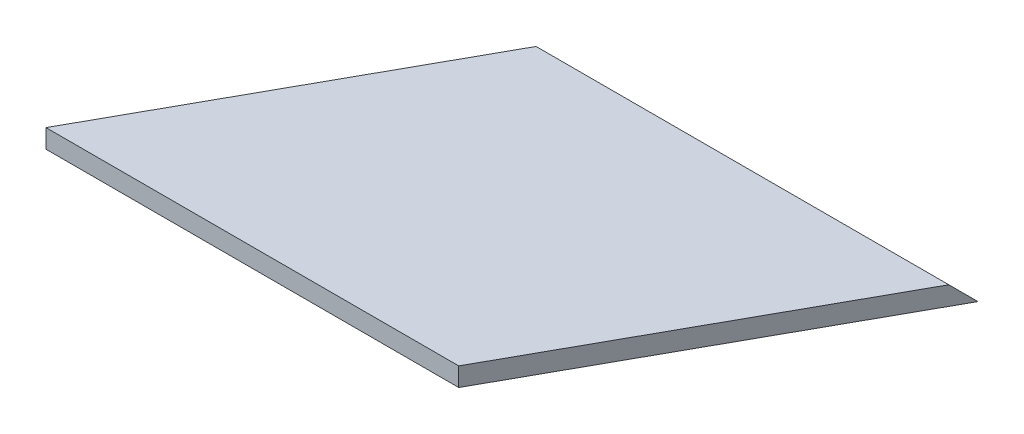
ISO-10303-21;
HEADER;
FILE_DESCRIPTION(('STEP AP214'),'2;1');
FILE_NAME('part.step','',(''),(''),'','','');
FILE_SCHEMA(('AUTOMOTIVE_DESIGN { 1 0 10303 214 1 1 1 1 }'));
ENDSEC;
DATA;
#1=APPLICATION_CONTEXT('core data for automotive mechanical design processes');
#2=APPLICATION_PROTOCOL_DEFINITION('international standard','automotive_design',2000,#1);
#3=PRODUCT_CONTEXT('',#1,'mechanical');
#4=PRODUCT('Part','Part','',(#3));
#5=PRODUCT_RELATED_PRODUCT_CATEGORY('part','',(#4));
#6=PRODUCT_DEFINITION_FORMATION('','',#4);
#7=PRODUCT_DEFINITION_CONTEXT('part definition',#1,'design');
#8=PRODUCT_DEFINITION('design','',#6,#7);
#9=PRODUCT_DEFINITION_SHAPE('','',#8);
#10=(LENGTH_UNIT() NAMED_UNIT(*) SI_UNIT(.MILLI.,.METRE.));
#11=(NAMED_UNIT(*) PLANE_ANGLE_UNIT() SI_UNIT($,.RADIAN.));
#12=(NAMED_UNIT(*) SI_UNIT($,.STERADIAN.) SOLID_ANGLE_UNIT());
#13=UNCERTAINTY_MEASURE_WITH_UNIT(LENGTH_MEASURE(1.E-05),#10,'distance_accuracy_value','');
#14=(GEOMETRIC_REPRESENTATION_CONTEXT(3) GLOBAL_UNCERTAINTY_ASSIGNED_CONTEXT((#13)) GLOBAL_UNIT_ASSIGNED_CONTEXT((#10,
#11,#12)) REPRESENTATION_CONTEXT('',''));
#15=CARTESIAN_POINT('',(0.,0.,0.));
#16=DIRECTION('',(0.,0.,1.));
#17=DIRECTION('',(1.,0.,0.));
#18=AXIS2_PLACEMENT_3D('',#15,#16,#17);
#19=CARTESIAN_POINT('',(-78.0951656166969,0.5,29.7866320004089));
#20=DIRECTION('',(0.874619707139394,0.,0.484809620246341));
#21=DIRECTION('',(0.484809620246341,0.,-0.874619707139394));
#22=AXIS2_PLACEMENT_3D('',#19,#20,#21);
#23=PLANE('',#22);
#24=DIRECTION('',(-0.484809620246341,0.,0.874619707139394));
#25=VECTOR('',#24,1.);
#26=CARTESIAN_POINT('',(-78.0951656166969,0.5,29.7866320004089));
#27=LINE('',#26,#25);
#28=CARTESIAN_POINT('',(-78.3723201424233,0.5,30.2866320004089));
#29=VERTEX_POINT('',#28);
#30=CARTESIAN_POINT('',(-83.0305275508046,0.5,38.690260619088));
#31=VERTEX_POINT('',#30);
#32=EDGE_CURVE('E72',#29,#31,#27,.T.);
#33=ORIENTED_EDGE('',*,*,#32,.F.);
#34=DIRECTION('',(0.364925188258724,-0.658342466720147,-0.658342466720146));
#35=VECTOR('',#34,1.);
#36=CARTESIAN_POINT('',(-67.9354474667235,-18.3286167226497,11.4580152777593));
#37=LINE('',#36,#35);
#38=CARTESIAN_POINT('',(-78.0951656166969,0.,29.7866320004089));
#39=VERTEX_POINT('',#38);
#40=EDGE_CURVE('E41',#29,#39,#37,.T.);
#41=ORIENTED_EDGE('',*,*,#40,.T.);
#42=DIRECTION('',(-0.484809620246341,0.,0.874619707139394));
#43=VECTOR('',#42,1.);
#44=CARTESIAN_POINT('',(-78.0951656166969,0.,29.7866320004089));
#45=LINE('',#44,#43);
#46=CARTESIAN_POINT('',(-83.0305275508046,0.,38.690260619088));
#47=VERTEX_POINT('',#46);
#48=EDGE_CURVE('E85',#39,#47,#45,.T.);
#49=ORIENTED_EDGE('',*,*,#48,.T.);
#50=DIRECTION('',(0.,-1.,0.));
#51=VECTOR('',#50,1.);
#52=CARTESIAN_POINT('',(-83.0305275508046,0.5,38.690260619088));
#53=LINE('',#52,#51);
#54=EDGE_CURVE('E83',#31,#47,#53,.T.);
#55=ORIENTED_EDGE('',*,*,#54,.F.);
#56=EDGE_LOOP('',(#33,#41,#49,#55));
#57=FACE_BOUND('',#56,.T.);
#58=ADVANCED_FACE('F33',(#57),#23,.F.);
#59=CARTESIAN_POINT('',(-83.0305275508046,0.5,38.690260619088));
#60=DIRECTION('',(0.,0.,-1.));
#61=DIRECTION('',(-1.,0.,0.));
#62=AXIS2_PLACEMENT_3D('',#59,#60,#61);
#63=PLANE('',#62);
#64=DIRECTION('',(1.,0.,0.));
#65=VECTOR('',#64,1.);
#66=CARTESIAN_POINT('',(-83.0305275508046,0.,38.690260619088));
#67=LINE('',#66,#65);
#68=CARTESIAN_POINT('',(-72.0305275508046,0.,38.690260619088));
#69=VERTEX_POINT('',#68);
#70=EDGE_CURVE('E99',#47,#69,#67,.T.);
#71=ORIENTED_EDGE('',*,*,#70,.T.);
#72=DIRECTION('',(0.,-1.,0.));
#73=VECTOR('',#72,1.);
#74=CARTESIAN_POINT('',(-72.0305275508046,0.5,38.690260619088));
#75=LINE('',#74,#73);
#76=CARTESIAN_POINT('',(-72.0305275508046,0.5,38.690260619088));
#77=VERTEX_POINT('',#76);
#78=EDGE_CURVE('E88',#77,#69,#75,.T.);
#79=ORIENTED_EDGE('',*,*,#78,.F.);
#80=DIRECTION('',(1.,0.,0.));
#81=VECTOR('',#80,1.);
#82=CARTESIAN_POINT('',(-83.0305275508046,0.5,38.690260619088));
#83=LINE('',#82,#81);
#84=EDGE_CURVE('E76',#31,#77,#83,.T.);
#85=ORIENTED_EDGE('',*,*,#84,.F.);
#86=ORIENTED_EDGE('',*,*,#54,.T.);
#87=EDGE_LOOP('',(#71,#79,#85,#86));
#88=FACE_BOUND('',#87,.T.);
#89=ADVANCED_FACE('F90',(#88),#63,.F.);
#90=CARTESIAN_POINT('',(-72.0305275508046,0.5,38.690260619088));
#91=DIRECTION('',(-0.874619707139393,0.,-0.484809620246341));
#92=DIRECTION('',(-0.484809620246341,0.,0.874619707139393));
#93=AXIS2_PLACEMENT_3D('',#90,#91,#92);
#94=PLANE('',#93);
#95=DIRECTION('',(0.484809620246342,0.,-0.874619707139393));
#96=VECTOR('',#95,1.);
#97=CARTESIAN_POINT('',(-72.0305275508046,0.,38.690260619088));
#98=LINE('',#97,#96);
#99=CARTESIAN_POINT('',(-67.0951656166969,0.,29.7866320004089));
#100=VERTEX_POINT('',#99);
#101=EDGE_CURVE('E80',#69,#100,#98,.T.);
#102=ORIENTED_EDGE('',*,*,#101,.T.);
#103=DIRECTION('',(-0.364925188258725,0.658342466720147,0.658342466720146));
#104=VECTOR('',#103,1.);
#105=CARTESIAN_POINT('',(-58.4003217900058,-15.6859134879775,14.1007185124314));
#106=LINE('',#105,#104);
#107=CARTESIAN_POINT('',(-67.3723201424232,0.5,30.2866320004089));
#108=VERTEX_POINT('',#107);
#109=EDGE_CURVE('E11',#100,#108,#106,.T.);
#110=ORIENTED_EDGE('',*,*,#109,.T.);
#111=DIRECTION('',(0.484809620246342,0.,-0.874619707139393));
#112=VECTOR('',#111,1.);
#113=CARTESIAN_POINT('',(-72.0305275508046,0.5,38.690260619088));
#114=LINE('',#113,#112);
#115=EDGE_CURVE('E92',#77,#108,#114,.T.);
#116=ORIENTED_EDGE('',*,*,#115,.F.);
#117=ORIENTED_EDGE('',*,*,#78,.T.);
#118=EDGE_LOOP('',(#102,#110,#116,#117));
#119=FACE_BOUND('',#118,.T.);
#120=ADVANCED_FACE('F116',(#119),#94,.F.);
#121=CARTESIAN_POINT('',(0.,0.5,0.));
#122=DIRECTION('',(0.,1.,0.));
#123=DIRECTION('',(0.,0.,1.));
#124=AXIS2_PLACEMENT_3D('',#121,#122,#123);
#125=PLANE('',#124);
#126=ORIENTED_EDGE('',*,*,#115,.T.);
#127=DIRECTION('',(-1.,0.,0.));
#128=VECTOR('',#127,1.);
#129=CARTESIAN_POINT('',(-78.0951656166969,0.5,30.2866320004089));
#130=LINE('',#129,#128);
#131=EDGE_CURVE('E78',#108,#29,#130,.T.);
#132=ORIENTED_EDGE('',*,*,#131,.T.);
#133=ORIENTED_EDGE('',*,*,#32,.T.);
#134=ORIENTED_EDGE('',*,*,#84,.T.);
#135=EDGE_LOOP('',(#126,#132,#133,#134));
#136=FACE_BOUND('',#135,.T.);
#137=ADVANCED_FACE('F74',(#136),#125,.T.);
#138=CARTESIAN_POINT('',(0.,0.,0.));
#139=DIRECTION('',(0.,1.,0.));
#140=DIRECTION('',(0.,0.,1.));
#141=AXIS2_PLACEMENT_3D('',#138,#139,#140);
#142=PLANE('',#141);
#143=DIRECTION('',(-1.,0.,0.));
#144=VECTOR('',#143,1.);
#145=CARTESIAN_POINT('',(-67.0951656166969,0.,29.7866320004089));
#146=LINE('',#145,#144);
#147=EDGE_CURVE('E96',#100,#39,#146,.T.);
#148=ORIENTED_EDGE('',*,*,#147,.F.);
#149=ORIENTED_EDGE('',*,*,#101,.F.);
#150=ORIENTED_EDGE('',*,*,#70,.F.);
#151=ORIENTED_EDGE('',*,*,#48,.F.);
#152=EDGE_LOOP('',(#148,#149,#150,#151));
#153=FACE_BOUND('',#152,.T.);
#154=ADVANCED_FACE('F105',(#153),#142,.F.);
#155=CARTESIAN_POINT('',(0.,0.5,30.2866320004089));
#156=DIRECTION('',(0.,0.707106781186547,-0.707106781186548));
#157=DIRECTION('',(1.,0.,0.));
#158=AXIS2_PLACEMENT_3D('',#155,#156,#157);
#159=PLANE('',#158);
#160=ORIENTED_EDGE('',*,*,#109,.F.);
#161=ORIENTED_EDGE('',*,*,#147,.T.);
#162=ORIENTED_EDGE('',*,*,#40,.F.);
#163=ORIENTED_EDGE('',*,*,#131,.F.);
#164=EDGE_LOOP('',(#160,#161,#162,#163));
#165=FACE_BOUND('',#164,.T.);
#166=ADVANCED_FACE('F35',(#165),#159,.T.);
#167=CLOSED_SHELL('',(#58,#89,#120,#137,#154,#166));
#168=MANIFOLD_SOLID_BREP('B2',#167);
#169=ADVANCED_BREP_SHAPE_REPRESENTATION('',(#18,#168),#14);
#170=SHAPE_DEFINITION_REPRESENTATION(#9,#169);
ENDSEC;
END-ISO-10303-21;
